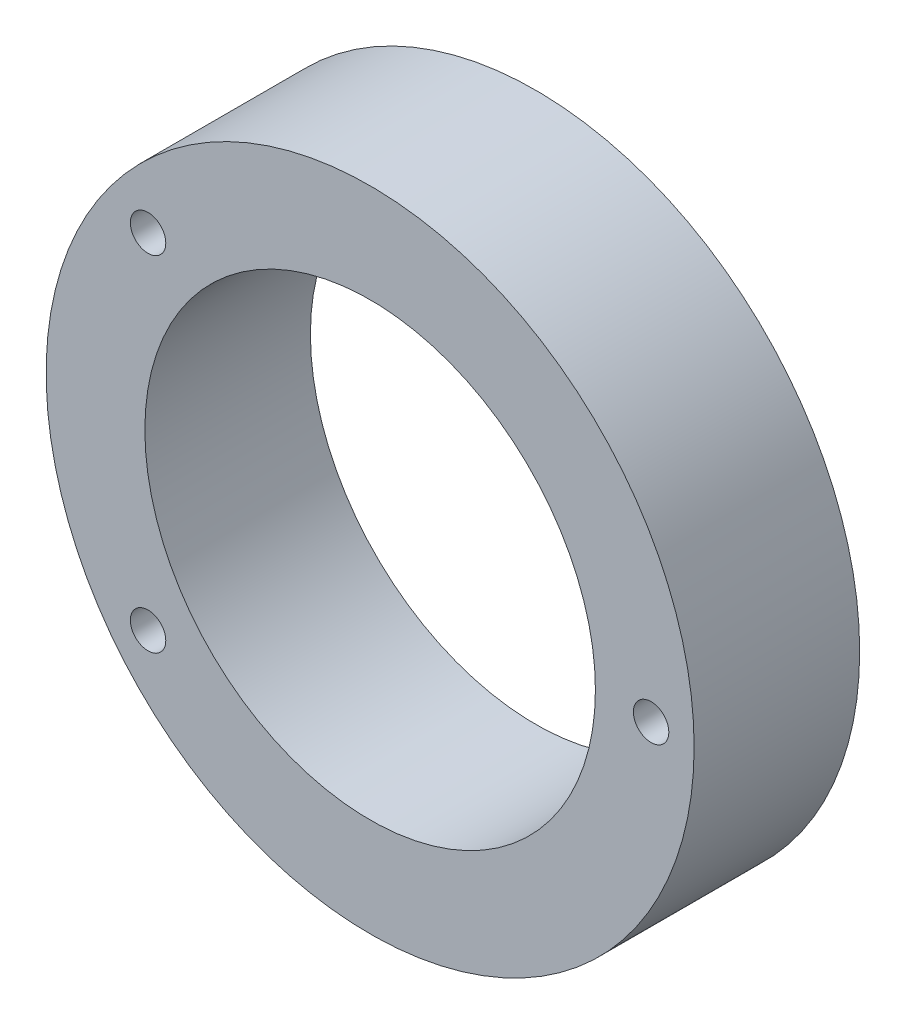
ISO-10303-21;
HEADER;
FILE_DESCRIPTION(('STEP AP214'),'2;1');
FILE_NAME('part.step','',(''),(''),'','','');
FILE_SCHEMA(('AUTOMOTIVE_DESIGN { 1 0 10303 214 1 1 1 1 }'));
ENDSEC;
DATA;
#1=APPLICATION_CONTEXT('core data for automotive mechanical design processes');
#2=APPLICATION_PROTOCOL_DEFINITION('international standard','automotive_design',2000,#1);
#3=PRODUCT_CONTEXT('',#1,'mechanical');
#4=PRODUCT('Part','Part','',(#3));
#5=PRODUCT_RELATED_PRODUCT_CATEGORY('part','',(#4));
#6=PRODUCT_DEFINITION_FORMATION('','',#4);
#7=PRODUCT_DEFINITION_CONTEXT('part definition',#1,'design');
#8=PRODUCT_DEFINITION('design','',#6,#7);
#9=PRODUCT_DEFINITION_SHAPE('','',#8);
#10=(LENGTH_UNIT() NAMED_UNIT(*) SI_UNIT(.MILLI.,.METRE.));
#11=(NAMED_UNIT(*) PLANE_ANGLE_UNIT() SI_UNIT($,.RADIAN.));
#12=(NAMED_UNIT(*) SI_UNIT($,.STERADIAN.) SOLID_ANGLE_UNIT());
#13=UNCERTAINTY_MEASURE_WITH_UNIT(LENGTH_MEASURE(1.E-05),#10,'distance_accuracy_value','');
#14=(GEOMETRIC_REPRESENTATION_CONTEXT(3) GLOBAL_UNCERTAINTY_ASSIGNED_CONTEXT((#13)) GLOBAL_UNIT_ASSIGNED_CONTEXT((#10,
#11,#12)) REPRESENTATION_CONTEXT('',''));
#15=CARTESIAN_POINT('',(0.,0.,0.));
#16=DIRECTION('',(0.,0.,1.));
#17=DIRECTION('',(1.,0.,0.));
#18=AXIS2_PLACEMENT_3D('',#15,#16,#17);
#19=CARTESIAN_POINT('',(0.,0.,16.35));
#20=DIRECTION('',(0.,0.,1.));
#21=DIRECTION('',(1.,0.,0.));
#22=AXIS2_PLACEMENT_3D('',#19,#20,#21);
#23=PLANE('',#22);
#24=CARTESIAN_POINT('',(-21.9327372290304,-17.0005158051837,16.35));
#25=DIRECTION('',(0.,0.,1.));
#26=DIRECTION('',(1.,0.,0.));
#27=AXIS2_PLACEMENT_3D('',#24,#25,#26);
#28=CIRCLE('',#27,1.75);
#29=CARTESIAN_POINT('',(-20.1827372290304,-17.0005158051837,16.35));
#30=VERTEX_POINT('',#29);
#31=EDGE_CURVE('E53',#30,#30,#28,.T.);
#32=ORIENTED_EDGE('',*,*,#31,.F.);
#33=EDGE_LOOP('',(#32));
#34=FACE_BOUND('',#33,.T.);
#35=CARTESIAN_POINT('',(0.,0.,16.35));
#36=DIRECTION('',(0.,0.,1.));
#37=DIRECTION('',(1.,0.,0.));
#38=AXIS2_PLACEMENT_3D('',#35,#36,#37);
#39=CIRCLE('',#38,22.25);
#40=CARTESIAN_POINT('',(22.25,0.,16.35));
#41=VERTEX_POINT('',#40);
#42=EDGE_CURVE('E42',#41,#41,#39,.T.);
#43=ORIENTED_EDGE('',*,*,#42,.F.);
#44=EDGE_LOOP('',(#43));
#45=FACE_BOUND('',#44,.T.);
#46=CARTESIAN_POINT('',(0.,0.,16.35));
#47=DIRECTION('',(0.,0.,1.));
#48=DIRECTION('',(1.,0.,0.));
#49=AXIS2_PLACEMENT_3D('',#46,#47,#48);
#50=CIRCLE('',#49,32.);
#51=CARTESIAN_POINT('',(32.,0.,16.35));
#52=VERTEX_POINT('',#51);
#53=EDGE_CURVE('E10',#52,#52,#50,.T.);
#54=ORIENTED_EDGE('',*,*,#53,.T.);
#55=EDGE_LOOP('',(#54));
#56=FACE_BOUND('',#55,.T.);
#57=CARTESIAN_POINT('',(-21.9327372290304,17.0005158051837,16.35));
#58=DIRECTION('',(0.,0.,1.));
#59=DIRECTION('',(1.,0.,0.));
#60=AXIS2_PLACEMENT_3D('',#57,#58,#59);
#61=CIRCLE('',#60,1.75);
#62=CARTESIAN_POINT('',(-20.1827372290304,17.0005158051837,16.35));
#63=VERTEX_POINT('',#62);
#64=EDGE_CURVE('E47',#63,#63,#61,.T.);
#65=ORIENTED_EDGE('',*,*,#64,.F.);
#66=EDGE_LOOP('',(#65));
#67=FACE_BOUND('',#66,.T.);
#68=CARTESIAN_POINT('',(27.75,0.,16.35));
#69=DIRECTION('',(0.,0.,1.));
#70=DIRECTION('',(1.,0.,0.));
#71=AXIS2_PLACEMENT_3D('',#68,#69,#70);
#72=CIRCLE('',#71,1.75);
#73=CARTESIAN_POINT('',(29.5,0.,16.35));
#74=VERTEX_POINT('',#73);
#75=EDGE_CURVE('E59',#74,#74,#72,.T.);
#76=ORIENTED_EDGE('',*,*,#75,.F.);
#77=EDGE_LOOP('',(#76));
#78=FACE_BOUND('',#77,.T.);
#79=ADVANCED_FACE('F31',(#34,#45,#56,#67,#78),#23,.T.);
#80=CARTESIAN_POINT('',(0.,0.,0.));
#81=DIRECTION('',(0.,0.,1.));
#82=DIRECTION('',(1.,0.,0.));
#83=AXIS2_PLACEMENT_3D('',#80,#81,#82);
#84=PLANE('',#83);
#85=CARTESIAN_POINT('',(-21.9327372290304,-17.0005158051837,0.));
#86=DIRECTION('',(0.,0.,1.));
#87=DIRECTION('',(1.,0.,0.));
#88=AXIS2_PLACEMENT_3D('',#85,#86,#87);
#89=CIRCLE('',#88,1.75);
#90=CARTESIAN_POINT('',(-20.1827372290304,-17.0005158051837,0.));
#91=VERTEX_POINT('',#90);
#92=EDGE_CURVE('E56',#91,#91,#89,.T.);
#93=ORIENTED_EDGE('',*,*,#92,.T.);
#94=EDGE_LOOP('',(#93));
#95=FACE_BOUND('',#94,.T.);
#96=CARTESIAN_POINT('',(0.,0.,0.));
#97=DIRECTION('',(0.,0.,1.));
#98=DIRECTION('',(1.,0.,0.));
#99=AXIS2_PLACEMENT_3D('',#96,#97,#98);
#100=CIRCLE('',#99,22.25);
#101=CARTESIAN_POINT('',(22.25,0.,0.));
#102=VERTEX_POINT('',#101);
#103=EDGE_CURVE('E44',#102,#102,#100,.T.);
#104=ORIENTED_EDGE('',*,*,#103,.T.);
#105=EDGE_LOOP('',(#104));
#106=FACE_BOUND('',#105,.T.);
#107=CARTESIAN_POINT('',(0.,0.,0.));
#108=DIRECTION('',(0.,0.,1.));
#109=DIRECTION('',(1.,0.,0.));
#110=AXIS2_PLACEMENT_3D('',#107,#108,#109);
#111=CIRCLE('',#110,32.);
#112=CARTESIAN_POINT('',(32.,0.,0.));
#113=VERTEX_POINT('',#112);
#114=EDGE_CURVE('E35',#113,#113,#111,.T.);
#115=ORIENTED_EDGE('',*,*,#114,.F.);
#116=EDGE_LOOP('',(#115));
#117=FACE_BOUND('',#116,.T.);
#118=CARTESIAN_POINT('',(-21.9327372290304,17.0005158051837,0.));
#119=DIRECTION('',(0.,0.,1.));
#120=DIRECTION('',(1.,0.,0.));
#121=AXIS2_PLACEMENT_3D('',#118,#119,#120);
#122=CIRCLE('',#121,1.75);
#123=CARTESIAN_POINT('',(-20.1827372290304,17.0005158051837,0.));
#124=VERTEX_POINT('',#123);
#125=EDGE_CURVE('E50',#124,#124,#122,.T.);
#126=ORIENTED_EDGE('',*,*,#125,.T.);
#127=EDGE_LOOP('',(#126));
#128=FACE_BOUND('',#127,.T.);
#129=CARTESIAN_POINT('',(27.75,0.,0.));
#130=DIRECTION('',(0.,0.,1.));
#131=DIRECTION('',(1.,0.,0.));
#132=AXIS2_PLACEMENT_3D('',#129,#130,#131);
#133=CIRCLE('',#132,1.75);
#134=CARTESIAN_POINT('',(29.5,0.,0.));
#135=VERTEX_POINT('',#134);
#136=EDGE_CURVE('E62',#135,#135,#133,.T.);
#137=ORIENTED_EDGE('',*,*,#136,.T.);
#138=EDGE_LOOP('',(#137));
#139=FACE_BOUND('',#138,.T.);
#140=ADVANCED_FACE('F72',(#95,#106,#117,#128,#139),#84,.F.);
#141=CARTESIAN_POINT('',(0.,0.,16.35));
#142=DIRECTION('',(0.,0.,-1.));
#143=DIRECTION('',(-1.,0.,0.));
#144=AXIS2_PLACEMENT_3D('',#141,#142,#143);
#145=CYLINDRICAL_SURFACE('',#144,32.);
#146=ORIENTED_EDGE('',*,*,#53,.F.);
#147=EDGE_LOOP('',(#146));
#148=FACE_BOUND('',#147,.T.);
#149=ORIENTED_EDGE('',*,*,#114,.T.);
#150=EDGE_LOOP('',(#149));
#151=FACE_BOUND('',#150,.T.);
#152=ADVANCED_FACE('F33',(#148,#151),#145,.T.);
#153=CARTESIAN_POINT('',(0.,0.,16.35));
#154=DIRECTION('',(0.,0.,-1.));
#155=DIRECTION('',(-1.,0.,0.));
#156=AXIS2_PLACEMENT_3D('',#153,#154,#155);
#157=CYLINDRICAL_SURFACE('',#156,22.25);
#158=ORIENTED_EDGE('',*,*,#42,.T.);
#159=EDGE_LOOP('',(#158));
#160=FACE_BOUND('',#159,.T.);
#161=ORIENTED_EDGE('',*,*,#103,.F.);
#162=EDGE_LOOP('',(#161));
#163=FACE_BOUND('',#162,.T.);
#164=ADVANCED_FACE('F82',(#160,#163),#157,.F.);
#165=CARTESIAN_POINT('',(-21.9327372290304,17.0005158051837,16.35));
#166=DIRECTION('',(0.,0.,-1.));
#167=DIRECTION('',(-1.,0.,0.));
#168=AXIS2_PLACEMENT_3D('',#165,#166,#167);
#169=CYLINDRICAL_SURFACE('',#168,1.75);
#170=ORIENTED_EDGE('',*,*,#64,.T.);
#171=EDGE_LOOP('',(#170));
#172=FACE_BOUND('',#171,.T.);
#173=ORIENTED_EDGE('',*,*,#125,.F.);
#174=EDGE_LOOP('',(#173));
#175=FACE_BOUND('',#174,.T.);
#176=ADVANCED_FACE('F85',(#172,#175),#169,.F.);
#177=CARTESIAN_POINT('',(-21.9327372290304,-17.0005158051837,16.35));
#178=DIRECTION('',(0.,0.,-1.));
#179=DIRECTION('',(-1.,0.,0.));
#180=AXIS2_PLACEMENT_3D('',#177,#178,#179);
#181=CYLINDRICAL_SURFACE('',#180,1.75);
#182=ORIENTED_EDGE('',*,*,#31,.T.);
#183=EDGE_LOOP('',(#182));
#184=FACE_BOUND('',#183,.T.);
#185=ORIENTED_EDGE('',*,*,#92,.F.);
#186=EDGE_LOOP('',(#185));
#187=FACE_BOUND('',#186,.T.);
#188=ADVANCED_FACE('F89',(#184,#187),#181,.F.);
#189=CARTESIAN_POINT('',(27.75,0.,16.35));
#190=DIRECTION('',(0.,0.,-1.));
#191=DIRECTION('',(-1.,0.,0.));
#192=AXIS2_PLACEMENT_3D('',#189,#190,#191);
#193=CYLINDRICAL_SURFACE('',#192,1.75);
#194=ORIENTED_EDGE('',*,*,#75,.T.);
#195=EDGE_LOOP('',(#194));
#196=FACE_BOUND('',#195,.T.);
#197=ORIENTED_EDGE('',*,*,#136,.F.);
#198=EDGE_LOOP('',(#197));
#199=FACE_BOUND('',#198,.T.);
#200=ADVANCED_FACE('F68',(#196,#199),#193,.F.);
#201=CLOSED_SHELL('',(#79,#140,#152,#164,#176,#188,#200));
#202=MANIFOLD_SOLID_BREP('B2',#201);
#203=ADVANCED_BREP_SHAPE_REPRESENTATION('',(#18,#202),#14);
#204=SHAPE_DEFINITION_REPRESENTATION(#9,#203);
ENDSEC;
END-ISO-10303-21;
